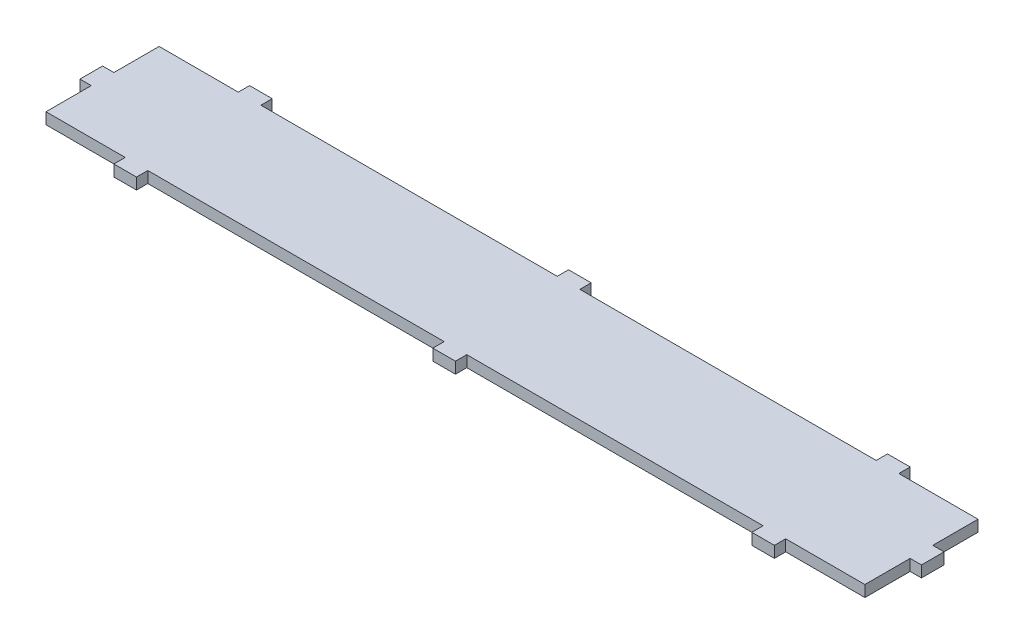
ISO-10303-21;
HEADER;
FILE_DESCRIPTION(('STEP AP214'),'2;1');
FILE_NAME('part.step','',(''),(''),'','','');
FILE_SCHEMA(('AUTOMOTIVE_DESIGN { 1 0 10303 214 1 1 1 1 }'));
ENDSEC;
DATA;
#1=APPLICATION_CONTEXT('core data for automotive mechanical design processes');
#2=APPLICATION_PROTOCOL_DEFINITION('international standard','automotive_design',2000,#1);
#3=PRODUCT_CONTEXT('',#1,'mechanical');
#4=PRODUCT('Part','Part','',(#3));
#5=PRODUCT_RELATED_PRODUCT_CATEGORY('part','',(#4));
#6=PRODUCT_DEFINITION_FORMATION('','',#4);
#7=PRODUCT_DEFINITION_CONTEXT('part definition',#1,'design');
#8=PRODUCT_DEFINITION('design','',#6,#7);
#9=PRODUCT_DEFINITION_SHAPE('','',#8);
#10=(LENGTH_UNIT() NAMED_UNIT(*) SI_UNIT(.MILLI.,.METRE.));
#11=(NAMED_UNIT(*) PLANE_ANGLE_UNIT() SI_UNIT($,.RADIAN.));
#12=(NAMED_UNIT(*) SI_UNIT($,.STERADIAN.) SOLID_ANGLE_UNIT());
#13=UNCERTAINTY_MEASURE_WITH_UNIT(LENGTH_MEASURE(1.E-05),#10,'distance_accuracy_value','');
#14=(GEOMETRIC_REPRESENTATION_CONTEXT(3) GLOBAL_UNCERTAINTY_ASSIGNED_CONTEXT((#13)) GLOBAL_UNIT_ASSIGNED_CONTEXT((#10,
#11,#12)) REPRESENTATION_CONTEXT('',''));
#15=CARTESIAN_POINT('',(0.,0.,0.));
#16=DIRECTION('',(0.,0.,1.));
#17=DIRECTION('',(1.,0.,0.));
#18=AXIS2_PLACEMENT_3D('',#15,#16,#17);
#19=CARTESIAN_POINT('',(0.,5.,30.));
#20=DIRECTION('',(0.,0.,1.));
#21=DIRECTION('',(1.,0.,0.));
#22=AXIS2_PLACEMENT_3D('',#19,#20,#21);
#23=PLANE('',#22);
#24=DIRECTION('',(-1.,0.,0.));
#25=VECTOR('',#24,1.);
#26=CARTESIAN_POINT('',(0.,0.,30.));
#27=LINE('',#26,#25);
#28=CARTESIAN_POINT('',(146.,0.,30.0000000000001));
#29=VERTEX_POINT('',#28);
#30=CARTESIAN_POINT('',(136.,0.,30.0000000000001));
#31=VERTEX_POINT('',#30);
#32=EDGE_CURVE('E309',#29,#31,#27,.T.);
#33=ORIENTED_EDGE('',*,*,#32,.F.);
#34=DIRECTION('',(0.,-1.,0.));
#35=VECTOR('',#34,1.);
#36=CARTESIAN_POINT('',(146.,5.,30.0000000000001));
#37=LINE('',#36,#35);
#38=CARTESIAN_POINT('',(146.,5.,30.0000000000001));
#39=VERTEX_POINT('',#38);
#40=EDGE_CURVE('E11',#39,#29,#37,.T.);
#41=ORIENTED_EDGE('',*,*,#40,.F.);
#42=DIRECTION('',(-1.,0.,0.));
#43=VECTOR('',#42,1.);
#44=CARTESIAN_POINT('',(0.,5.,30.));
#45=LINE('',#44,#43);
#46=CARTESIAN_POINT('',(136.,5.,30.0000000000001));
#47=VERTEX_POINT('',#46);
#48=EDGE_CURVE('E439',#39,#47,#45,.T.);
#49=ORIENTED_EDGE('',*,*,#48,.T.);
#50=DIRECTION('',(0.,-1.,0.));
#51=VECTOR('',#50,1.);
#52=CARTESIAN_POINT('',(136.,5.,30.0000000000001));
#53=LINE('',#52,#51);
#54=EDGE_CURVE('E176',#47,#31,#53,.T.);
#55=ORIENTED_EDGE('',*,*,#54,.T.);
#56=EDGE_LOOP('',(#33,#41,#49,#55));
#57=FACE_BOUND('',#56,.T.);
#58=ADVANCED_FACE('F41',(#57),#23,.T.);
#59=CARTESIAN_POINT('',(146.,5.,0.));
#60=DIRECTION('',(-1.,0.,0.));
#61=DIRECTION('',(0.,0.,1.));
#62=AXIS2_PLACEMENT_3D('',#59,#60,#61);
#63=PLANE('',#62);
#64=DIRECTION('',(0.,0.,-1.));
#65=VECTOR('',#64,1.);
#66=CARTESIAN_POINT('',(146.,0.,0.));
#67=LINE('',#66,#65);
#68=CARTESIAN_POINT('',(146.,0.,25.0000000000001));
#69=VERTEX_POINT('',#68);
#70=EDGE_CURVE('E313',#29,#69,#67,.T.);
#71=ORIENTED_EDGE('',*,*,#70,.T.);
#72=DIRECTION('',(0.,-1.,0.));
#73=VECTOR('',#72,1.);
#74=CARTESIAN_POINT('',(146.,5.,25.0000000000001));
#75=LINE('',#74,#73);
#76=CARTESIAN_POINT('',(146.,5.,25.0000000000001));
#77=VERTEX_POINT('',#76);
#78=EDGE_CURVE('E50',#77,#69,#75,.T.);
#79=ORIENTED_EDGE('',*,*,#78,.F.);
#80=DIRECTION('',(0.,0.,-1.));
#81=VECTOR('',#80,1.);
#82=CARTESIAN_POINT('',(146.,5.,0.));
#83=LINE('',#82,#81);
#84=EDGE_CURVE('E572',#39,#77,#83,.T.);
#85=ORIENTED_EDGE('',*,*,#84,.F.);
#86=ORIENTED_EDGE('',*,*,#40,.T.);
#87=EDGE_LOOP('',(#71,#79,#85,#86));
#88=FACE_BOUND('',#87,.T.);
#89=ADVANCED_FACE('F682',(#88),#63,.F.);
#90=CARTESIAN_POINT('',(-1.51168760049403E-13,5.,24.9999999999992));
#91=DIRECTION('',(0.,0.,-1.));
#92=DIRECTION('',(-1.,0.,0.));
#93=AXIS2_PLACEMENT_3D('',#90,#91,#92);
#94=PLANE('',#93);
#95=DIRECTION('',(1.,0.,0.));
#96=VECTOR('',#95,1.);
#97=CARTESIAN_POINT('',(-1.51168760049403E-13,0.,24.9999999999992));
#98=LINE('',#97,#96);
#99=CARTESIAN_POINT('',(181.,0.,25.0000000000003));
#100=VERTEX_POINT('',#99);
#101=EDGE_CURVE('E316',#69,#100,#98,.T.);
#102=ORIENTED_EDGE('',*,*,#101,.T.);
#103=DIRECTION('',(0.,-1.,0.));
#104=VECTOR('',#103,1.);
#105=CARTESIAN_POINT('',(181.,5.,25.0000000000003));
#106=LINE('',#105,#104);
#107=CARTESIAN_POINT('',(181.,5.,25.0000000000003));
#108=VERTEX_POINT('',#107);
#109=EDGE_CURVE('E541',#108,#100,#106,.T.);
#110=ORIENTED_EDGE('',*,*,#109,.F.);
#111=DIRECTION('',(1.,0.,0.));
#112=VECTOR('',#111,1.);
#113=CARTESIAN_POINT('',(-1.51168760049403E-13,5.,24.9999999999992));
#114=LINE('',#113,#112);
#115=EDGE_CURVE('E551',#77,#108,#114,.T.);
#116=ORIENTED_EDGE('',*,*,#115,.F.);
#117=ORIENTED_EDGE('',*,*,#78,.T.);
#118=EDGE_LOOP('',(#102,#110,#116,#117));
#119=FACE_BOUND('',#118,.T.);
#120=ADVANCED_FACE('F549',(#119),#94,.F.);
#121=CARTESIAN_POINT('',(181.,5.,0.));
#122=DIRECTION('',(1.,0.,0.));
#123=DIRECTION('',(0.,0.,-1.));
#124=AXIS2_PLACEMENT_3D('',#121,#122,#123);
#125=PLANE('',#124);
#126=DIRECTION('',(0.,0.,1.));
#127=VECTOR('',#126,1.);
#128=CARTESIAN_POINT('',(181.,0.,0.));
#129=LINE('',#128,#127);
#130=CARTESIAN_POINT('',(181.,0.,5.));
#131=VERTEX_POINT('',#130);
#132=EDGE_CURVE('E320',#131,#100,#129,.T.);
#133=ORIENTED_EDGE('',*,*,#132,.F.);
#134=DIRECTION('',(0.,-1.,0.));
#135=VECTOR('',#134,1.);
#136=CARTESIAN_POINT('',(181.,5.,5.));
#137=LINE('',#136,#135);
#138=CARTESIAN_POINT('',(181.,5.,5.));
#139=VERTEX_POINT('',#138);
#140=EDGE_CURVE('E538',#139,#131,#137,.T.);
#141=ORIENTED_EDGE('',*,*,#140,.F.);
#142=DIRECTION('',(0.,0.,1.));
#143=VECTOR('',#142,1.);
#144=CARTESIAN_POINT('',(181.,5.,0.));
#145=LINE('',#144,#143);
#146=EDGE_CURVE('E562',#139,#108,#145,.T.);
#147=ORIENTED_EDGE('',*,*,#146,.T.);
#148=ORIENTED_EDGE('',*,*,#109,.T.);
#149=EDGE_LOOP('',(#133,#141,#147,#148));
#150=FACE_BOUND('',#149,.T.);
#151=ADVANCED_FACE('F559',(#150),#125,.T.);
#152=CARTESIAN_POINT('',(0.,5.,5.00000000000003));
#153=DIRECTION('',(0.,0.,1.));
#154=DIRECTION('',(1.,0.,0.));
#155=AXIS2_PLACEMENT_3D('',#152,#153,#154);
#156=PLANE('',#155);
#157=DIRECTION('',(-1.,0.,0.));
#158=VECTOR('',#157,1.);
#159=CARTESIAN_POINT('',(0.,0.,5.00000000000003));
#160=LINE('',#159,#158);
#161=CARTESIAN_POINT('',(186.,0.,5.));
#162=VERTEX_POINT('',#161);
#163=EDGE_CURVE('E324',#162,#131,#160,.T.);
#164=ORIENTED_EDGE('',*,*,#163,.F.);
#165=DIRECTION('',(0.,-1.,0.));
#166=VECTOR('',#165,1.);
#167=CARTESIAN_POINT('',(186.,5.,5.));
#168=LINE('',#167,#166);
#169=CARTESIAN_POINT('',(186.,5.,5.));
#170=VERTEX_POINT('',#169);
#171=EDGE_CURVE('E535',#170,#162,#168,.T.);
#172=ORIENTED_EDGE('',*,*,#171,.F.);
#173=DIRECTION('',(-1.,0.,0.));
#174=VECTOR('',#173,1.);
#175=CARTESIAN_POINT('',(0.,5.,5.00000000000003));
#176=LINE('',#175,#174);
#177=EDGE_CURVE('E566',#170,#139,#176,.T.);
#178=ORIENTED_EDGE('',*,*,#177,.T.);
#179=ORIENTED_EDGE('',*,*,#140,.T.);
#180=EDGE_LOOP('',(#164,#172,#178,#179));
#181=FACE_BOUND('',#180,.T.);
#182=ADVANCED_FACE('F692',(#181),#156,.T.);
#183=CARTESIAN_POINT('',(186.,5.,0.));
#184=DIRECTION('',(1.,0.,0.));
#185=DIRECTION('',(0.,0.,-1.));
#186=AXIS2_PLACEMENT_3D('',#183,#184,#185);
#187=PLANE('',#186);
#188=DIRECTION('',(0.,0.,1.));
#189=VECTOR('',#188,1.);
#190=CARTESIAN_POINT('',(186.,0.,0.));
#191=LINE('',#190,#189);
#192=CARTESIAN_POINT('',(186.,0.,-5.));
#193=VERTEX_POINT('',#192);
#194=EDGE_CURVE('E328',#193,#162,#191,.T.);
#195=ORIENTED_EDGE('',*,*,#194,.F.);
#196=DIRECTION('',(0.,-1.,0.));
#197=VECTOR('',#196,1.);
#198=CARTESIAN_POINT('',(186.,5.,-5.));
#199=LINE('',#198,#197);
#200=CARTESIAN_POINT('',(186.,5.,-5.));
#201=VERTEX_POINT('',#200);
#202=EDGE_CURVE('E532',#201,#193,#199,.T.);
#203=ORIENTED_EDGE('',*,*,#202,.F.);
#204=DIRECTION('',(0.,0.,1.));
#205=VECTOR('',#204,1.);
#206=CARTESIAN_POINT('',(186.,5.,0.));
#207=LINE('',#206,#205);
#208=EDGE_CURVE('E570',#201,#170,#207,.T.);
#209=ORIENTED_EDGE('',*,*,#208,.T.);
#210=ORIENTED_EDGE('',*,*,#171,.T.);
#211=EDGE_LOOP('',(#195,#203,#209,#210));
#212=FACE_BOUND('',#211,.T.);
#213=ADVANCED_FACE('F695',(#212),#187,.T.);
#214=CARTESIAN_POINT('',(0.,5.,-4.99999999999997));
#215=DIRECTION('',(0.,0.,1.));
#216=DIRECTION('',(1.,0.,0.));
#217=AXIS2_PLACEMENT_3D('',#214,#215,#216);
#218=PLANE('',#217);
#219=DIRECTION('',(-1.,0.,0.));
#220=VECTOR('',#219,1.);
#221=CARTESIAN_POINT('',(0.,0.,-4.99999999999997));
#222=LINE('',#221,#220);
#223=CARTESIAN_POINT('',(181.,0.,-5.));
#224=VERTEX_POINT('',#223);
#225=EDGE_CURVE('E332',#193,#224,#222,.T.);
#226=ORIENTED_EDGE('',*,*,#225,.T.);
#227=DIRECTION('',(0.,-1.,0.));
#228=VECTOR('',#227,1.);
#229=CARTESIAN_POINT('',(181.,5.,-5.));
#230=LINE('',#229,#228);
#231=CARTESIAN_POINT('',(181.,5.,-5.));
#232=VERTEX_POINT('',#231);
#233=EDGE_CURVE('E528',#232,#224,#230,.T.);
#234=ORIENTED_EDGE('',*,*,#233,.F.);
#235=DIRECTION('',(-1.,0.,0.));
#236=VECTOR('',#235,1.);
#237=CARTESIAN_POINT('',(0.,5.,-4.99999999999997));
#238=LINE('',#237,#236);
#239=EDGE_CURVE('E579',#201,#232,#238,.T.);
#240=ORIENTED_EDGE('',*,*,#239,.F.);
#241=ORIENTED_EDGE('',*,*,#202,.T.);
#242=EDGE_LOOP('',(#226,#234,#240,#241));
#243=FACE_BOUND('',#242,.T.);
#244=ADVANCED_FACE('F699',(#243),#218,.F.);
#245=CARTESIAN_POINT('',(181.,5.,0.));
#246=DIRECTION('',(-1.,0.,0.));
#247=DIRECTION('',(0.,0.,1.));
#248=AXIS2_PLACEMENT_3D('',#245,#246,#247);
#249=PLANE('',#248);
#250=DIRECTION('',(0.,0.,-1.));
#251=VECTOR('',#250,1.);
#252=CARTESIAN_POINT('',(181.,0.,0.));
#253=LINE('',#252,#251);
#254=CARTESIAN_POINT('',(181.,0.,-25.0000000000001));
#255=VERTEX_POINT('',#254);
#256=EDGE_CURVE('E335',#224,#255,#253,.T.);
#257=ORIENTED_EDGE('',*,*,#256,.T.);
#258=DIRECTION('',(0.,-1.,0.));
#259=VECTOR('',#258,1.);
#260=CARTESIAN_POINT('',(181.,5.,-25.0000000000001));
#261=LINE('',#260,#259);
#262=CARTESIAN_POINT('',(181.,5.,-25.0000000000001));
#263=VERTEX_POINT('',#262);
#264=EDGE_CURVE('E525',#263,#255,#261,.T.);
#265=ORIENTED_EDGE('',*,*,#264,.F.);
#266=DIRECTION('',(0.,0.,-1.));
#267=VECTOR('',#266,1.);
#268=CARTESIAN_POINT('',(181.,5.,0.));
#269=LINE('',#268,#267);
#270=EDGE_CURVE('E582',#232,#263,#269,.T.);
#271=ORIENTED_EDGE('',*,*,#270,.F.);
#272=ORIENTED_EDGE('',*,*,#233,.T.);
#273=EDGE_LOOP('',(#257,#265,#271,#272));
#274=FACE_BOUND('',#273,.T.);
#275=ADVANCED_FACE('F703',(#274),#249,.F.);
#276=CARTESIAN_POINT('',(0.,5.,-25.0000000000001));
#277=DIRECTION('',(0.,0.,-1.));
#278=DIRECTION('',(-1.,0.,0.));
#279=AXIS2_PLACEMENT_3D('',#276,#277,#278);
#280=PLANE('',#279);
#281=DIRECTION('',(1.,0.,0.));
#282=VECTOR('',#281,1.);
#283=CARTESIAN_POINT('',(0.,0.,-25.0000000000001));
#284=LINE('',#283,#282);
#285=CARTESIAN_POINT('',(146.,0.,-25.0000000000001));
#286=VERTEX_POINT('',#285);
#287=EDGE_CURVE('E339',#286,#255,#284,.T.);
#288=ORIENTED_EDGE('',*,*,#287,.F.);
#289=DIRECTION('',(0.,-1.,0.));
#290=VECTOR('',#289,1.);
#291=CARTESIAN_POINT('',(146.,5.,-25.0000000000001));
#292=LINE('',#291,#290);
#293=CARTESIAN_POINT('',(146.,5.,-25.0000000000001));
#294=VERTEX_POINT('',#293);
#295=EDGE_CURVE('E522',#294,#286,#292,.T.);
#296=ORIENTED_EDGE('',*,*,#295,.F.);
#297=DIRECTION('',(1.,0.,0.));
#298=VECTOR('',#297,1.);
#299=CARTESIAN_POINT('',(0.,5.,-25.0000000000001));
#300=LINE('',#299,#298);
#301=EDGE_CURVE('E585',#294,#263,#300,.T.);
#302=ORIENTED_EDGE('',*,*,#301,.T.);
#303=ORIENTED_EDGE('',*,*,#264,.T.);
#304=EDGE_LOOP('',(#288,#296,#302,#303));
#305=FACE_BOUND('',#304,.T.);
#306=ADVANCED_FACE('F707',(#305),#280,.T.);
#307=CARTESIAN_POINT('',(146.,5.,0.));
#308=DIRECTION('',(1.,0.,0.));
#309=DIRECTION('',(0.,0.,-1.));
#310=AXIS2_PLACEMENT_3D('',#307,#308,#309);
#311=PLANE('',#310);
#312=DIRECTION('',(0.,0.,1.));
#313=VECTOR('',#312,1.);
#314=CARTESIAN_POINT('',(146.,0.,0.));
#315=LINE('',#314,#313);
#316=CARTESIAN_POINT('',(146.,0.,-30.0000000000001));
#317=VERTEX_POINT('',#316);
#318=EDGE_CURVE('E343',#317,#286,#315,.T.);
#319=ORIENTED_EDGE('',*,*,#318,.F.);
#320=DIRECTION('',(0.,-1.,0.));
#321=VECTOR('',#320,1.);
#322=CARTESIAN_POINT('',(146.,5.,-30.0000000000001));
#323=LINE('',#322,#321);
#324=CARTESIAN_POINT('',(146.,5.,-30.0000000000001));
#325=VERTEX_POINT('',#324);
#326=EDGE_CURVE('E519',#325,#317,#323,.T.);
#327=ORIENTED_EDGE('',*,*,#326,.F.);
#328=DIRECTION('',(0.,0.,1.));
#329=VECTOR('',#328,1.);
#330=CARTESIAN_POINT('',(146.,5.,0.));
#331=LINE('',#330,#329);
#332=EDGE_CURVE('E589',#325,#294,#331,.T.);
#333=ORIENTED_EDGE('',*,*,#332,.T.);
#334=ORIENTED_EDGE('',*,*,#295,.T.);
#335=EDGE_LOOP('',(#319,#327,#333,#334));
#336=FACE_BOUND('',#335,.T.);
#337=ADVANCED_FACE('F711',(#336),#311,.T.);
#338=CARTESIAN_POINT('',(0.,5.,-30.));
#339=DIRECTION('',(0.,0.,1.));
#340=DIRECTION('',(1.,0.,0.));
#341=AXIS2_PLACEMENT_3D('',#338,#339,#340);
#342=PLANE('',#341);
#343=DIRECTION('',(-1.,0.,0.));
#344=VECTOR('',#343,1.);
#345=CARTESIAN_POINT('',(0.,0.,-30.));
#346=LINE('',#345,#344);
#347=CARTESIAN_POINT('',(136.,0.,-30.0000000000001));
#348=VERTEX_POINT('',#347);
#349=EDGE_CURVE('E347',#317,#348,#346,.T.);
#350=ORIENTED_EDGE('',*,*,#349,.T.);
#351=DIRECTION('',(0.,-1.,0.));
#352=VECTOR('',#351,1.);
#353=CARTESIAN_POINT('',(136.,5.,-30.0000000000001));
#354=LINE('',#353,#352);
#355=CARTESIAN_POINT('',(136.,5.,-30.0000000000001));
#356=VERTEX_POINT('',#355);
#357=EDGE_CURVE('E516',#356,#348,#354,.T.);
#358=ORIENTED_EDGE('',*,*,#357,.F.);
#359=DIRECTION('',(-1.,0.,0.));
#360=VECTOR('',#359,1.);
#361=CARTESIAN_POINT('',(0.,5.,-30.));
#362=LINE('',#361,#360);
#363=EDGE_CURVE('E593',#325,#356,#362,.T.);
#364=ORIENTED_EDGE('',*,*,#363,.F.);
#365=ORIENTED_EDGE('',*,*,#326,.T.);
#366=EDGE_LOOP('',(#350,#358,#364,#365));
#367=FACE_BOUND('',#366,.T.);
#368=ADVANCED_FACE('F715',(#367),#342,.F.);
#369=CARTESIAN_POINT('',(136.,5.,0.));
#370=DIRECTION('',(-1.,0.,0.));
#371=DIRECTION('',(0.,0.,1.));
#372=AXIS2_PLACEMENT_3D('',#369,#370,#371);
#373=PLANE('',#372);
#374=DIRECTION('',(0.,0.,-1.));
#375=VECTOR('',#374,1.);
#376=CARTESIAN_POINT('',(136.,0.,0.));
#377=LINE('',#376,#375);
#378=CARTESIAN_POINT('',(136.,0.,-25.0000000000001));
#379=VERTEX_POINT('',#378);
#380=EDGE_CURVE('E351',#379,#348,#377,.T.);
#381=ORIENTED_EDGE('',*,*,#380,.F.);
#382=DIRECTION('',(0.,-1.,0.));
#383=VECTOR('',#382,1.);
#384=CARTESIAN_POINT('',(136.,5.,-25.0000000000001));
#385=LINE('',#384,#383);
#386=CARTESIAN_POINT('',(136.,5.,-25.0000000000001));
#387=VERTEX_POINT('',#386);
#388=EDGE_CURVE('E513',#387,#379,#385,.T.);
#389=ORIENTED_EDGE('',*,*,#388,.F.);
#390=DIRECTION('',(0.,0.,-1.));
#391=VECTOR('',#390,1.);
#392=CARTESIAN_POINT('',(136.,5.,0.));
#393=LINE('',#392,#391);
#394=EDGE_CURVE('E596',#387,#356,#393,.T.);
#395=ORIENTED_EDGE('',*,*,#394,.T.);
#396=ORIENTED_EDGE('',*,*,#357,.T.);
#397=EDGE_LOOP('',(#381,#389,#395,#396));
#398=FACE_BOUND('',#397,.T.);
#399=ADVANCED_FACE('F719',(#398),#373,.T.);
#400=CARTESIAN_POINT('',(0.,5.,-25.0000000000001));
#401=DIRECTION('',(0.,0.,-1.));
#402=DIRECTION('',(-1.,0.,0.));
#403=AXIS2_PLACEMENT_3D('',#400,#401,#402);
#404=PLANE('',#403);
#405=DIRECTION('',(1.,0.,0.));
#406=VECTOR('',#405,1.);
#407=CARTESIAN_POINT('',(0.,0.,-25.0000000000001));
#408=LINE('',#407,#406);
#409=CARTESIAN_POINT('',(5.,0.,-25.0000000000001));
#410=VERTEX_POINT('',#409);
#411=EDGE_CURVE('E355',#410,#379,#408,.T.);
#412=ORIENTED_EDGE('',*,*,#411,.F.);
#413=DIRECTION('',(0.,-1.,0.));
#414=VECTOR('',#413,1.);
#415=CARTESIAN_POINT('',(5.,5.,-25.0000000000001));
#416=LINE('',#415,#414);
#417=CARTESIAN_POINT('',(5.,5.,-25.0000000000001));
#418=VERTEX_POINT('',#417);
#419=EDGE_CURVE('E510',#418,#410,#416,.T.);
#420=ORIENTED_EDGE('',*,*,#419,.F.);
#421=DIRECTION('',(1.,0.,0.));
#422=VECTOR('',#421,1.);
#423=CARTESIAN_POINT('',(0.,5.,-25.0000000000001));
#424=LINE('',#423,#422);
#425=EDGE_CURVE('E600',#418,#387,#424,.T.);
#426=ORIENTED_EDGE('',*,*,#425,.T.);
#427=ORIENTED_EDGE('',*,*,#388,.T.);
#428=EDGE_LOOP('',(#412,#420,#426,#427));
#429=FACE_BOUND('',#428,.T.);
#430=ADVANCED_FACE('F723',(#429),#404,.T.);
#431=CARTESIAN_POINT('',(4.99999999999998,5.,0.));
#432=DIRECTION('',(-1.,0.,0.));
#433=DIRECTION('',(0.,0.,1.));
#434=AXIS2_PLACEMENT_3D('',#431,#432,#433);
#435=PLANE('',#434);
#436=DIRECTION('',(0.,0.,-1.));
#437=VECTOR('',#436,1.);
#438=CARTESIAN_POINT('',(4.99999999999998,0.,0.));
#439=LINE('',#438,#437);
#440=CARTESIAN_POINT('',(5.,0.,-30.));
#441=VERTEX_POINT('',#440);
#442=EDGE_CURVE('E359',#410,#441,#439,.T.);
#443=ORIENTED_EDGE('',*,*,#442,.T.);
#444=DIRECTION('',(0.,-1.,0.));
#445=VECTOR('',#444,1.);
#446=CARTESIAN_POINT('',(5.,5.,-30.));
#447=LINE('',#446,#445);
#448=CARTESIAN_POINT('',(5.,5.,-30.));
#449=VERTEX_POINT('',#448);
#450=EDGE_CURVE('E506',#449,#441,#447,.T.);
#451=ORIENTED_EDGE('',*,*,#450,.F.);
#452=DIRECTION('',(0.,0.,-1.));
#453=VECTOR('',#452,1.);
#454=CARTESIAN_POINT('',(4.99999999999998,5.,0.));
#455=LINE('',#454,#453);
#456=EDGE_CURVE('E604',#418,#449,#455,.T.);
#457=ORIENTED_EDGE('',*,*,#456,.F.);
#458=ORIENTED_EDGE('',*,*,#419,.T.);
#459=EDGE_LOOP('',(#443,#451,#457,#458));
#460=FACE_BOUND('',#459,.T.);
#461=ADVANCED_FACE('F727',(#460),#435,.F.);
#462=CARTESIAN_POINT('',(0.,5.,-30.));
#463=DIRECTION('',(0.,0.,1.));
#464=DIRECTION('',(1.,0.,0.));
#465=AXIS2_PLACEMENT_3D('',#462,#463,#464);
#466=PLANE('',#465);
#467=DIRECTION('',(-1.,0.,0.));
#468=VECTOR('',#467,1.);
#469=CARTESIAN_POINT('',(0.,0.,-30.));
#470=LINE('',#469,#468);
#471=CARTESIAN_POINT('',(-5.,0.,-30.));
#472=VERTEX_POINT('',#471);
#473=EDGE_CURVE('E362',#441,#472,#470,.T.);
#474=ORIENTED_EDGE('',*,*,#473,.T.);
#475=DIRECTION('',(0.,-1.,0.));
#476=VECTOR('',#475,1.);
#477=CARTESIAN_POINT('',(-5.,5.,-30.));
#478=LINE('',#477,#476);
#479=CARTESIAN_POINT('',(-5.,5.,-30.));
#480=VERTEX_POINT('',#479);
#481=EDGE_CURVE('E503',#480,#472,#478,.T.);
#482=ORIENTED_EDGE('',*,*,#481,.F.);
#483=DIRECTION('',(-1.,0.,0.));
#484=VECTOR('',#483,1.);
#485=CARTESIAN_POINT('',(0.,5.,-30.));
#486=LINE('',#485,#484);
#487=EDGE_CURVE('E607',#449,#480,#486,.T.);
#488=ORIENTED_EDGE('',*,*,#487,.F.);
#489=ORIENTED_EDGE('',*,*,#450,.T.);
#490=EDGE_LOOP('',(#474,#482,#488,#489));
#491=FACE_BOUND('',#490,.T.);
#492=ADVANCED_FACE('F731',(#491),#466,.F.);
#493=CARTESIAN_POINT('',(-5.,5.,0.));
#494=DIRECTION('',(-1.,0.,0.));
#495=DIRECTION('',(0.,0.,1.));
#496=AXIS2_PLACEMENT_3D('',#493,#494,#495);
#497=PLANE('',#496);
#498=DIRECTION('',(0.,0.,-1.));
#499=VECTOR('',#498,1.);
#500=CARTESIAN_POINT('',(-5.,0.,0.));
#501=LINE('',#500,#499);
#502=CARTESIAN_POINT('',(-5.,0.,-25.0000000000001));
#503=VERTEX_POINT('',#502);
#504=EDGE_CURVE('E366',#503,#472,#501,.T.);
#505=ORIENTED_EDGE('',*,*,#504,.F.);
#506=DIRECTION('',(0.,-1.,0.));
#507=VECTOR('',#506,1.);
#508=CARTESIAN_POINT('',(-5.,5.,-25.0000000000001));
#509=LINE('',#508,#507);
#510=CARTESIAN_POINT('',(-5.,5.,-25.0000000000001));
#511=VERTEX_POINT('',#510);
#512=EDGE_CURVE('E500',#511,#503,#509,.T.);
#513=ORIENTED_EDGE('',*,*,#512,.F.);
#514=DIRECTION('',(0.,0.,-1.));
#515=VECTOR('',#514,1.);
#516=CARTESIAN_POINT('',(-5.,5.,0.));
#517=LINE('',#516,#515);
#518=EDGE_CURVE('E610',#511,#480,#517,.T.);
#519=ORIENTED_EDGE('',*,*,#518,.T.);
#520=ORIENTED_EDGE('',*,*,#481,.T.);
#521=EDGE_LOOP('',(#505,#513,#519,#520));
#522=FACE_BOUND('',#521,.T.);
#523=ADVANCED_FACE('F735',(#522),#497,.T.);
#524=CARTESIAN_POINT('',(0.,5.,-25.0000000000001));
#525=DIRECTION('',(0.,0.,-1.));
#526=DIRECTION('',(-1.,0.,0.));
#527=AXIS2_PLACEMENT_3D('',#524,#525,#526);
#528=PLANE('',#527);
#529=DIRECTION('',(1.,0.,0.));
#530=VECTOR('',#529,1.);
#531=CARTESIAN_POINT('',(0.,0.,-25.0000000000001));
#532=LINE('',#531,#530);
#533=CARTESIAN_POINT('',(-136.,0.,-25.));
#534=VERTEX_POINT('',#533);
#535=EDGE_CURVE('E370',#534,#503,#532,.T.);
#536=ORIENTED_EDGE('',*,*,#535,.F.);
#537=DIRECTION('',(0.,-1.,0.));
#538=VECTOR('',#537,1.);
#539=CARTESIAN_POINT('',(-136.,5.,-25.));
#540=LINE('',#539,#538);
#541=CARTESIAN_POINT('',(-136.,5.,-25.));
#542=VERTEX_POINT('',#541);
#543=EDGE_CURVE('E497',#542,#534,#540,.T.);
#544=ORIENTED_EDGE('',*,*,#543,.F.);
#545=DIRECTION('',(1.,0.,0.));
#546=VECTOR('',#545,1.);
#547=CARTESIAN_POINT('',(0.,5.,-25.0000000000001));
#548=LINE('',#547,#546);
#549=EDGE_CURVE('E614',#542,#511,#548,.T.);
#550=ORIENTED_EDGE('',*,*,#549,.T.);
#551=ORIENTED_EDGE('',*,*,#512,.T.);
#552=EDGE_LOOP('',(#536,#544,#550,#551));
#553=FACE_BOUND('',#552,.T.);
#554=ADVANCED_FACE('F739',(#553),#528,.T.);
#555=CARTESIAN_POINT('',(-136.,5.,0.));
#556=DIRECTION('',(-1.,0.,0.));
#557=DIRECTION('',(0.,0.,1.));
#558=AXIS2_PLACEMENT_3D('',#555,#556,#557);
#559=PLANE('',#558);
#560=DIRECTION('',(0.,0.,-1.));
#561=VECTOR('',#560,1.);
#562=CARTESIAN_POINT('',(-136.,0.,0.));
#563=LINE('',#562,#561);
#564=CARTESIAN_POINT('',(-136.,0.,-30.));
#565=VERTEX_POINT('',#564);
#566=EDGE_CURVE('E374',#534,#565,#563,.T.);
#567=ORIENTED_EDGE('',*,*,#566,.T.);
#568=DIRECTION('',(0.,-1.,0.));
#569=VECTOR('',#568,1.);
#570=CARTESIAN_POINT('',(-136.,5.,-30.));
#571=LINE('',#570,#569);
#572=CARTESIAN_POINT('',(-136.,5.,-30.));
#573=VERTEX_POINT('',#572);
#574=EDGE_CURVE('E493',#573,#565,#571,.T.);
#575=ORIENTED_EDGE('',*,*,#574,.F.);
#576=DIRECTION('',(0.,0.,-1.));
#577=VECTOR('',#576,1.);
#578=CARTESIAN_POINT('',(-136.,5.,0.));
#579=LINE('',#578,#577);
#580=EDGE_CURVE('E618',#542,#573,#579,.T.);
#581=ORIENTED_EDGE('',*,*,#580,.F.);
#582=ORIENTED_EDGE('',*,*,#543,.T.);
#583=EDGE_LOOP('',(#567,#575,#581,#582));
#584=FACE_BOUND('',#583,.T.);
#585=ADVANCED_FACE('F743',(#584),#559,.F.);
#586=CARTESIAN_POINT('',(0.,5.,-30.0000000000001));
#587=DIRECTION('',(0.,0.,1.));
#588=DIRECTION('',(1.,0.,0.));
#589=AXIS2_PLACEMENT_3D('',#586,#587,#588);
#590=PLANE('',#589);
#591=DIRECTION('',(-1.,0.,0.));
#592=VECTOR('',#591,1.);
#593=CARTESIAN_POINT('',(0.,0.,-30.0000000000001));
#594=LINE('',#593,#592);
#595=CARTESIAN_POINT('',(-146.,0.,-30.));
#596=VERTEX_POINT('',#595);
#597=EDGE_CURVE('E377',#565,#596,#594,.T.);
#598=ORIENTED_EDGE('',*,*,#597,.T.);
#599=DIRECTION('',(0.,-1.,0.));
#600=VECTOR('',#599,1.);
#601=CARTESIAN_POINT('',(-146.,5.,-30.));
#602=LINE('',#601,#600);
#603=CARTESIAN_POINT('',(-146.,5.,-30.));
#604=VERTEX_POINT('',#603);
#605=EDGE_CURVE('E489',#604,#596,#602,.T.);
#606=ORIENTED_EDGE('',*,*,#605,.F.);
#607=DIRECTION('',(-1.,0.,0.));
#608=VECTOR('',#607,1.);
#609=CARTESIAN_POINT('',(0.,5.,-30.0000000000001));
#610=LINE('',#609,#608);
#611=EDGE_CURVE('E621',#573,#604,#610,.T.);
#612=ORIENTED_EDGE('',*,*,#611,.F.);
#613=ORIENTED_EDGE('',*,*,#574,.T.);
#614=EDGE_LOOP('',(#598,#606,#612,#613));
#615=FACE_BOUND('',#614,.T.);
#616=ADVANCED_FACE('F747',(#615),#590,.F.);
#617=CARTESIAN_POINT('',(-146.,5.,0.));
#618=DIRECTION('',(1.,0.,0.));
#619=DIRECTION('',(0.,0.,-1.));
#620=AXIS2_PLACEMENT_3D('',#617,#618,#619);
#621=PLANE('',#620);
#622=DIRECTION('',(0.,0.,1.));
#623=VECTOR('',#622,1.);
#624=CARTESIAN_POINT('',(-146.,0.,0.));
#625=LINE('',#624,#623);
#626=CARTESIAN_POINT('',(-146.,0.,-25.));
#627=VERTEX_POINT('',#626);
#628=EDGE_CURVE('E380',#596,#627,#625,.T.);
#629=ORIENTED_EDGE('',*,*,#628,.T.);
#630=DIRECTION('',(0.,-1.,0.));
#631=VECTOR('',#630,1.);
#632=CARTESIAN_POINT('',(-146.,5.,-25.));
#633=LINE('',#632,#631);
#634=CARTESIAN_POINT('',(-146.,5.,-25.));
#635=VERTEX_POINT('',#634);
#636=EDGE_CURVE('E486',#635,#627,#633,.T.);
#637=ORIENTED_EDGE('',*,*,#636,.F.);
#638=DIRECTION('',(0.,0.,1.));
#639=VECTOR('',#638,1.);
#640=CARTESIAN_POINT('',(-146.,5.,0.));
#641=LINE('',#640,#639);
#642=EDGE_CURVE('E624',#604,#635,#641,.T.);
#643=ORIENTED_EDGE('',*,*,#642,.F.);
#644=ORIENTED_EDGE('',*,*,#605,.T.);
#645=EDGE_LOOP('',(#629,#637,#643,#644));
#646=FACE_BOUND('',#645,.T.);
#647=ADVANCED_FACE('F751',(#646),#621,.F.);
#648=CARTESIAN_POINT('',(0.,5.,-25.0000000000001));
#649=DIRECTION('',(0.,0.,-1.));
#650=DIRECTION('',(-1.,0.,0.));
#651=AXIS2_PLACEMENT_3D('',#648,#649,#650);
#652=PLANE('',#651);
#653=DIRECTION('',(1.,0.,0.));
#654=VECTOR('',#653,1.);
#655=CARTESIAN_POINT('',(0.,0.,-25.0000000000001));
#656=LINE('',#655,#654);
#657=CARTESIAN_POINT('',(-181.,0.,-25.));
#658=VERTEX_POINT('',#657);
#659=EDGE_CURVE('E384',#658,#627,#656,.T.);
#660=ORIENTED_EDGE('',*,*,#659,.F.);
#661=DIRECTION('',(0.,-1.,0.));
#662=VECTOR('',#661,1.);
#663=CARTESIAN_POINT('',(-181.,5.,-25.));
#664=LINE('',#663,#662);
#665=CARTESIAN_POINT('',(-181.,5.,-25.));
#666=VERTEX_POINT('',#665);
#667=EDGE_CURVE('E483',#666,#658,#664,.T.);
#668=ORIENTED_EDGE('',*,*,#667,.F.);
#669=DIRECTION('',(1.,0.,0.));
#670=VECTOR('',#669,1.);
#671=CARTESIAN_POINT('',(0.,5.,-25.0000000000001));
#672=LINE('',#671,#670);
#673=EDGE_CURVE('E627',#666,#635,#672,.T.);
#674=ORIENTED_EDGE('',*,*,#673,.T.);
#675=ORIENTED_EDGE('',*,*,#636,.T.);
#676=EDGE_LOOP('',(#660,#668,#674,#675));
#677=FACE_BOUND('',#676,.T.);
#678=ADVANCED_FACE('F755',(#677),#652,.T.);
#679=CARTESIAN_POINT('',(-181.,5.,0.));
#680=DIRECTION('',(1.,0.,0.));
#681=DIRECTION('',(0.,0.,-1.));
#682=AXIS2_PLACEMENT_3D('',#679,#680,#681);
#683=PLANE('',#682);
#684=DIRECTION('',(0.,0.,1.));
#685=VECTOR('',#684,1.);
#686=CARTESIAN_POINT('',(-181.,0.,0.));
#687=LINE('',#686,#685);
#688=CARTESIAN_POINT('',(-181.,0.,-5.00000000000002));
#689=VERTEX_POINT('',#688);
#690=EDGE_CURVE('E388',#658,#689,#687,.T.);
#691=ORIENTED_EDGE('',*,*,#690,.T.);
#692=DIRECTION('',(0.,-1.,0.));
#693=VECTOR('',#692,1.);
#694=CARTESIAN_POINT('',(-181.,5.,-5.00000000000002));
#695=LINE('',#694,#693);
#696=CARTESIAN_POINT('',(-181.,5.,-5.00000000000002));
#697=VERTEX_POINT('',#696);
#698=EDGE_CURVE('E479',#697,#689,#695,.T.);
#699=ORIENTED_EDGE('',*,*,#698,.F.);
#700=DIRECTION('',(0.,0.,1.));
#701=VECTOR('',#700,1.);
#702=CARTESIAN_POINT('',(-181.,5.,0.));
#703=LINE('',#702,#701);
#704=EDGE_CURVE('E631',#666,#697,#703,.T.);
#705=ORIENTED_EDGE('',*,*,#704,.F.);
#706=ORIENTED_EDGE('',*,*,#667,.T.);
#707=EDGE_LOOP('',(#691,#699,#705,#706));
#708=FACE_BOUND('',#707,.T.);
#709=ADVANCED_FACE('F759',(#708),#683,.F.);
#710=CARTESIAN_POINT('',(0.,5.,-5.0000000000015));
#711=DIRECTION('',(0.,0.,1.));
#712=DIRECTION('',(1.,0.,0.));
#713=AXIS2_PLACEMENT_3D('',#710,#711,#712);
#714=PLANE('',#713);
#715=DIRECTION('',(-1.,0.,0.));
#716=VECTOR('',#715,1.);
#717=CARTESIAN_POINT('',(0.,0.,-5.0000000000015));
#718=LINE('',#717,#716);
#719=CARTESIAN_POINT('',(-186.,0.,-4.99999999999998));
#720=VERTEX_POINT('',#719);
#721=EDGE_CURVE('E391',#689,#720,#718,.T.);
#722=ORIENTED_EDGE('',*,*,#721,.T.);
#723=DIRECTION('',(0.,-1.,0.));
#724=VECTOR('',#723,1.);
#725=CARTESIAN_POINT('',(-186.,5.,-4.99999999999998));
#726=LINE('',#725,#724);
#727=CARTESIAN_POINT('',(-186.,5.,-4.99999999999998));
#728=VERTEX_POINT('',#727);
#729=EDGE_CURVE('E475',#728,#720,#726,.T.);
#730=ORIENTED_EDGE('',*,*,#729,.F.);
#731=DIRECTION('',(-1.,0.,0.));
#732=VECTOR('',#731,1.);
#733=CARTESIAN_POINT('',(0.,5.,-5.0000000000015));
#734=LINE('',#733,#732);
#735=EDGE_CURVE('E634',#697,#728,#734,.T.);
#736=ORIENTED_EDGE('',*,*,#735,.F.);
#737=ORIENTED_EDGE('',*,*,#698,.T.);
#738=EDGE_LOOP('',(#722,#730,#736,#737));
#739=FACE_BOUND('',#738,.T.);
#740=ADVANCED_FACE('F763',(#739),#714,.F.);
#741=CARTESIAN_POINT('',(-186.,5.,0.));
#742=DIRECTION('',(1.,0.,0.));
#743=DIRECTION('',(0.,0.,-1.));
#744=AXIS2_PLACEMENT_3D('',#741,#742,#743);
#745=PLANE('',#744);
#746=DIRECTION('',(0.,0.,1.));
#747=VECTOR('',#746,1.);
#748=CARTESIAN_POINT('',(-186.,0.,0.));
#749=LINE('',#748,#747);
#750=CARTESIAN_POINT('',(-186.,0.,4.99999999999998));
#751=VERTEX_POINT('',#750);
#752=EDGE_CURVE('E394',#720,#751,#749,.T.);
#753=ORIENTED_EDGE('',*,*,#752,.T.);
#754=DIRECTION('',(0.,-1.,0.));
#755=VECTOR('',#754,1.);
#756=CARTESIAN_POINT('',(-186.,5.,4.99999999999998));
#757=LINE('',#756,#755);
#758=CARTESIAN_POINT('',(-186.,5.,4.99999999999998));
#759=VERTEX_POINT('',#758);
#760=EDGE_CURVE('E472',#759,#751,#757,.T.);
#761=ORIENTED_EDGE('',*,*,#760,.F.);
#762=DIRECTION('',(0.,0.,1.));
#763=VECTOR('',#762,1.);
#764=CARTESIAN_POINT('',(-186.,5.,0.));
#765=LINE('',#764,#763);
#766=EDGE_CURVE('E637',#728,#759,#765,.T.);
#767=ORIENTED_EDGE('',*,*,#766,.F.);
#768=ORIENTED_EDGE('',*,*,#729,.T.);
#769=EDGE_LOOP('',(#753,#761,#767,#768));
#770=FACE_BOUND('',#769,.T.);
#771=ADVANCED_FACE('F767',(#770),#745,.F.);
#772=CARTESIAN_POINT('',(0.,5.,5.00000000000001));
#773=DIRECTION('',(0.,0.,1.));
#774=DIRECTION('',(1.,0.,0.));
#775=AXIS2_PLACEMENT_3D('',#772,#773,#774);
#776=PLANE('',#775);
#777=DIRECTION('',(-1.,0.,0.));
#778=VECTOR('',#777,1.);
#779=CARTESIAN_POINT('',(0.,0.,5.00000000000001));
#780=LINE('',#779,#778);
#781=CARTESIAN_POINT('',(-181.,0.,4.99999999999998));
#782=VERTEX_POINT('',#781);
#783=EDGE_CURVE('E398',#782,#751,#780,.T.);
#784=ORIENTED_EDGE('',*,*,#783,.F.);
#785=DIRECTION('',(0.,-1.,0.));
#786=VECTOR('',#785,1.);
#787=CARTESIAN_POINT('',(-181.,5.,4.99999999999998));
#788=LINE('',#787,#786);
#789=CARTESIAN_POINT('',(-181.,5.,4.99999999999998));
#790=VERTEX_POINT('',#789);
#791=EDGE_CURVE('E469',#790,#782,#788,.T.);
#792=ORIENTED_EDGE('',*,*,#791,.F.);
#793=DIRECTION('',(-1.,0.,0.));
#794=VECTOR('',#793,1.);
#795=CARTESIAN_POINT('',(0.,5.,5.00000000000001));
#796=LINE('',#795,#794);
#797=EDGE_CURVE('E640',#790,#759,#796,.T.);
#798=ORIENTED_EDGE('',*,*,#797,.T.);
#799=ORIENTED_EDGE('',*,*,#760,.T.);
#800=EDGE_LOOP('',(#784,#792,#798,#799));
#801=FACE_BOUND('',#800,.T.);
#802=ADVANCED_FACE('F771',(#801),#776,.T.);
#803=CARTESIAN_POINT('',(-181.,5.,0.));
#804=DIRECTION('',(1.,0.,0.));
#805=DIRECTION('',(0.,0.,-1.));
#806=AXIS2_PLACEMENT_3D('',#803,#804,#805);
#807=PLANE('',#806);
#808=DIRECTION('',(0.,0.,1.));
#809=VECTOR('',#808,1.);
#810=CARTESIAN_POINT('',(-181.,0.,0.));
#811=LINE('',#810,#809);
#812=CARTESIAN_POINT('',(-181.,0.,25.));
#813=VERTEX_POINT('',#812);
#814=EDGE_CURVE('E402',#782,#813,#811,.T.);
#815=ORIENTED_EDGE('',*,*,#814,.T.);
#816=DIRECTION('',(0.,-1.,0.));
#817=VECTOR('',#816,1.);
#818=CARTESIAN_POINT('',(-181.,5.,25.));
#819=LINE('',#818,#817);
#820=CARTESIAN_POINT('',(-181.,5.,25.));
#821=VERTEX_POINT('',#820);
#822=EDGE_CURVE('E465',#821,#813,#819,.T.);
#823=ORIENTED_EDGE('',*,*,#822,.F.);
#824=DIRECTION('',(0.,0.,1.));
#825=VECTOR('',#824,1.);
#826=CARTESIAN_POINT('',(-181.,5.,0.));
#827=LINE('',#826,#825);
#828=EDGE_CURVE('E644',#790,#821,#827,.T.);
#829=ORIENTED_EDGE('',*,*,#828,.F.);
#830=ORIENTED_EDGE('',*,*,#791,.T.);
#831=EDGE_LOOP('',(#815,#823,#829,#830));
#832=FACE_BOUND('',#831,.T.);
#833=ADVANCED_FACE('F775',(#832),#807,.F.);
#834=CARTESIAN_POINT('',(0.,5.,25.0000000000002));
#835=DIRECTION('',(0.,0.,-1.));
#836=DIRECTION('',(-1.,0.,0.));
#837=AXIS2_PLACEMENT_3D('',#834,#835,#836);
#838=PLANE('',#837);
#839=DIRECTION('',(1.,0.,0.));
#840=VECTOR('',#839,1.);
#841=CARTESIAN_POINT('',(0.,0.,25.0000000000002));
#842=LINE('',#841,#840);
#843=CARTESIAN_POINT('',(-146.,0.,25.));
#844=VERTEX_POINT('',#843);
#845=EDGE_CURVE('E405',#813,#844,#842,.T.);
#846=ORIENTED_EDGE('',*,*,#845,.T.);
#847=DIRECTION('',(0.,-1.,0.));
#848=VECTOR('',#847,1.);
#849=CARTESIAN_POINT('',(-146.,5.,25.));
#850=LINE('',#849,#848);
#851=CARTESIAN_POINT('',(-146.,5.,25.));
#852=VERTEX_POINT('',#851);
#853=EDGE_CURVE('E462',#852,#844,#850,.T.);
#854=ORIENTED_EDGE('',*,*,#853,.F.);
#855=DIRECTION('',(1.,0.,0.));
#856=VECTOR('',#855,1.);
#857=CARTESIAN_POINT('',(0.,5.,25.0000000000002));
#858=LINE('',#857,#856);
#859=EDGE_CURVE('E647',#821,#852,#858,.T.);
#860=ORIENTED_EDGE('',*,*,#859,.F.);
#861=ORIENTED_EDGE('',*,*,#822,.T.);
#862=EDGE_LOOP('',(#846,#854,#860,#861));
#863=FACE_BOUND('',#862,.T.);
#864=ADVANCED_FACE('F779',(#863),#838,.F.);
#865=CARTESIAN_POINT('',(-146.,5.,0.));
#866=DIRECTION('',(-1.,0.,0.));
#867=DIRECTION('',(0.,0.,1.));
#868=AXIS2_PLACEMENT_3D('',#865,#866,#867);
#869=PLANE('',#868);
#870=DIRECTION('',(0.,0.,-1.));
#871=VECTOR('',#870,1.);
#872=CARTESIAN_POINT('',(-146.,0.,0.));
#873=LINE('',#872,#871);
#874=CARTESIAN_POINT('',(-146.,0.,30.));
#875=VERTEX_POINT('',#874);
#876=EDGE_CURVE('E409',#875,#844,#873,.T.);
#877=ORIENTED_EDGE('',*,*,#876,.F.);
#878=DIRECTION('',(0.,-1.,0.));
#879=VECTOR('',#878,1.);
#880=CARTESIAN_POINT('',(-146.,5.,30.));
#881=LINE('',#880,#879);
#882=CARTESIAN_POINT('',(-146.,5.,30.));
#883=VERTEX_POINT('',#882);
#884=EDGE_CURVE('E459',#883,#875,#881,.T.);
#885=ORIENTED_EDGE('',*,*,#884,.F.);
#886=DIRECTION('',(0.,0.,-1.));
#887=VECTOR('',#886,1.);
#888=CARTESIAN_POINT('',(-146.,5.,0.));
#889=LINE('',#888,#887);
#890=EDGE_CURVE('E650',#883,#852,#889,.T.);
#891=ORIENTED_EDGE('',*,*,#890,.T.);
#892=ORIENTED_EDGE('',*,*,#853,.T.);
#893=EDGE_LOOP('',(#877,#885,#891,#892));
#894=FACE_BOUND('',#893,.T.);
#895=ADVANCED_FACE('F783',(#894),#869,.T.);
#896=CARTESIAN_POINT('',(0.,5.,30.0000000000001));
#897=DIRECTION('',(0.,0.,1.));
#898=DIRECTION('',(1.,0.,0.));
#899=AXIS2_PLACEMENT_3D('',#896,#897,#898);
#900=PLANE('',#899);
#901=DIRECTION('',(-1.,0.,0.));
#902=VECTOR('',#901,1.);
#903=CARTESIAN_POINT('',(0.,0.,30.0000000000001));
#904=LINE('',#903,#902);
#905=CARTESIAN_POINT('',(-136.,0.,30.));
#906=VERTEX_POINT('',#905);
#907=EDGE_CURVE('E413',#906,#875,#904,.T.);
#908=ORIENTED_EDGE('',*,*,#907,.F.);
#909=DIRECTION('',(0.,-1.,0.));
#910=VECTOR('',#909,1.);
#911=CARTESIAN_POINT('',(-136.,5.,30.));
#912=LINE('',#911,#910);
#913=CARTESIAN_POINT('',(-136.,5.,30.));
#914=VERTEX_POINT('',#913);
#915=EDGE_CURVE('E456',#914,#906,#912,.T.);
#916=ORIENTED_EDGE('',*,*,#915,.F.);
#917=DIRECTION('',(-1.,0.,0.));
#918=VECTOR('',#917,1.);
#919=CARTESIAN_POINT('',(0.,5.,30.0000000000001));
#920=LINE('',#919,#918);
#921=EDGE_CURVE('E654',#914,#883,#920,.T.);
#922=ORIENTED_EDGE('',*,*,#921,.T.);
#923=ORIENTED_EDGE('',*,*,#884,.T.);
#924=EDGE_LOOP('',(#908,#916,#922,#923));
#925=FACE_BOUND('',#924,.T.);
#926=ADVANCED_FACE('F787',(#925),#900,.T.);
#927=CARTESIAN_POINT('',(-136.,5.,0.));
#928=DIRECTION('',(1.,0.,0.));
#929=DIRECTION('',(0.,0.,-1.));
#930=AXIS2_PLACEMENT_3D('',#927,#928,#929);
#931=PLANE('',#930);
#932=DIRECTION('',(0.,0.,1.));
#933=VECTOR('',#932,1.);
#934=CARTESIAN_POINT('',(-136.,0.,0.));
#935=LINE('',#934,#933);
#936=CARTESIAN_POINT('',(-136.,0.,25.));
#937=VERTEX_POINT('',#936);
#938=EDGE_CURVE('E417',#937,#906,#935,.T.);
#939=ORIENTED_EDGE('',*,*,#938,.F.);
#940=DIRECTION('',(0.,-1.,0.));
#941=VECTOR('',#940,1.);
#942=CARTESIAN_POINT('',(-136.,5.,25.));
#943=LINE('',#942,#941);
#944=CARTESIAN_POINT('',(-136.,5.,25.));
#945=VERTEX_POINT('',#944);
#946=EDGE_CURVE('E453',#945,#937,#943,.T.);
#947=ORIENTED_EDGE('',*,*,#946,.F.);
#948=DIRECTION('',(0.,0.,1.));
#949=VECTOR('',#948,1.);
#950=CARTESIAN_POINT('',(-136.,5.,0.));
#951=LINE('',#950,#949);
#952=EDGE_CURVE('E658',#945,#914,#951,.T.);
#953=ORIENTED_EDGE('',*,*,#952,.T.);
#954=ORIENTED_EDGE('',*,*,#915,.T.);
#955=EDGE_LOOP('',(#939,#947,#953,#954));
#956=FACE_BOUND('',#955,.T.);
#957=ADVANCED_FACE('F791',(#956),#931,.T.);
#958=CARTESIAN_POINT('',(0.,5.,25.0000000000001));
#959=DIRECTION('',(0.,0.,-1.));
#960=DIRECTION('',(-1.,0.,0.));
#961=AXIS2_PLACEMENT_3D('',#958,#959,#960);
#962=PLANE('',#961);
#963=DIRECTION('',(1.,0.,0.));
#964=VECTOR('',#963,1.);
#965=CARTESIAN_POINT('',(0.,0.,25.0000000000001));
#966=LINE('',#965,#964);
#967=CARTESIAN_POINT('',(-5.,0.,25.0000000000001));
#968=VERTEX_POINT('',#967);
#969=EDGE_CURVE('E421',#937,#968,#966,.T.);
#970=ORIENTED_EDGE('',*,*,#969,.T.);
#971=DIRECTION('',(0.,-1.,0.));
#972=VECTOR('',#971,1.);
#973=CARTESIAN_POINT('',(-5.,5.,25.0000000000001));
#974=LINE('',#973,#972);
#975=CARTESIAN_POINT('',(-5.,5.,25.0000000000001));
#976=VERTEX_POINT('',#975);
#977=EDGE_CURVE('E449',#976,#968,#974,.T.);
#978=ORIENTED_EDGE('',*,*,#977,.F.);
#979=DIRECTION('',(1.,0.,0.));
#980=VECTOR('',#979,1.);
#981=CARTESIAN_POINT('',(0.,5.,25.0000000000001));
#982=LINE('',#981,#980);
#983=EDGE_CURVE('E662',#945,#976,#982,.T.);
#984=ORIENTED_EDGE('',*,*,#983,.F.);
#985=ORIENTED_EDGE('',*,*,#946,.T.);
#986=EDGE_LOOP('',(#970,#978,#984,#985));
#987=FACE_BOUND('',#986,.T.);
#988=ADVANCED_FACE('F795',(#987),#962,.F.);
#989=CARTESIAN_POINT('',(-5.,5.,0.));
#990=DIRECTION('',(1.,0.,0.));
#991=DIRECTION('',(0.,0.,-1.));
#992=AXIS2_PLACEMENT_3D('',#989,#990,#991);
#993=PLANE('',#992);
#994=DIRECTION('',(0.,0.,1.));
#995=VECTOR('',#994,1.);
#996=CARTESIAN_POINT('',(-5.,0.,0.));
#997=LINE('',#996,#995);
#998=CARTESIAN_POINT('',(-5.,0.,30.));
#999=VERTEX_POINT('',#998);
#1000=EDGE_CURVE('E424',#968,#999,#997,.T.);
#1001=ORIENTED_EDGE('',*,*,#1000,.T.);
#1002=DIRECTION('',(0.,-1.,0.));
#1003=VECTOR('',#1002,1.);
#1004=CARTESIAN_POINT('',(-5.,5.,30.));
#1005=LINE('',#1004,#1003);
#1006=CARTESIAN_POINT('',(-5.,5.,30.));
#1007=VERTEX_POINT('',#1006);
#1008=EDGE_CURVE('E446',#1007,#999,#1005,.T.);
#1009=ORIENTED_EDGE('',*,*,#1008,.F.);
#1010=DIRECTION('',(0.,0.,1.));
#1011=VECTOR('',#1010,1.);
#1012=CARTESIAN_POINT('',(-5.,5.,0.));
#1013=LINE('',#1012,#1011);
#1014=EDGE_CURVE('E303',#976,#1007,#1013,.T.);
#1015=ORIENTED_EDGE('',*,*,#1014,.F.);
#1016=ORIENTED_EDGE('',*,*,#977,.T.);
#1017=EDGE_LOOP('',(#1001,#1009,#1015,#1016));
#1018=FACE_BOUND('',#1017,.T.);
#1019=ADVANCED_FACE('F671',(#1018),#993,.F.);
#1020=CARTESIAN_POINT('',(0.,5.,30.));
#1021=DIRECTION('',(0.,0.,1.));
#1022=DIRECTION('',(1.,0.,0.));
#1023=AXIS2_PLACEMENT_3D('',#1020,#1021,#1022);
#1024=PLANE('',#1023);
#1025=DIRECTION('',(-1.,0.,0.));
#1026=VECTOR('',#1025,1.);
#1027=CARTESIAN_POINT('',(0.,0.,30.));
#1028=LINE('',#1027,#1026);
#1029=CARTESIAN_POINT('',(5.,0.,30.));
#1030=VERTEX_POINT('',#1029);
#1031=EDGE_CURVE('E428',#1030,#999,#1028,.T.);
#1032=ORIENTED_EDGE('',*,*,#1031,.F.);
#1033=DIRECTION('',(0.,-1.,0.));
#1034=VECTOR('',#1033,1.);
#1035=CARTESIAN_POINT('',(5.,5.,30.));
#1036=LINE('',#1035,#1034);
#1037=CARTESIAN_POINT('',(5.,5.,30.));
#1038=VERTEX_POINT('',#1037);
#1039=EDGE_CURVE('E289',#1038,#1030,#1036,.T.);
#1040=ORIENTED_EDGE('',*,*,#1039,.F.);
#1041=DIRECTION('',(-1.,0.,0.));
#1042=VECTOR('',#1041,1.);
#1043=CARTESIAN_POINT('',(0.,5.,30.));
#1044=LINE('',#1043,#1042);
#1045=EDGE_CURVE('E299',#1038,#1007,#1044,.T.);
#1046=ORIENTED_EDGE('',*,*,#1045,.T.);
#1047=ORIENTED_EDGE('',*,*,#1008,.T.);
#1048=EDGE_LOOP('',(#1032,#1040,#1046,#1047));
#1049=FACE_BOUND('',#1048,.T.);
#1050=ADVANCED_FACE('F675',(#1049),#1024,.T.);
#1051=CARTESIAN_POINT('',(4.99999999999998,5.,0.));
#1052=DIRECTION('',(1.,0.,0.));
#1053=DIRECTION('',(0.,0.,-1.));
#1054=AXIS2_PLACEMENT_3D('',#1051,#1052,#1053);
#1055=PLANE('',#1054);
#1056=DIRECTION('',(0.,0.,1.));
#1057=VECTOR('',#1056,1.);
#1058=CARTESIAN_POINT('',(4.99999999999998,0.,0.));
#1059=LINE('',#1058,#1057);
#1060=CARTESIAN_POINT('',(5.,0.,25.0000000000001));
#1061=VERTEX_POINT('',#1060);
#1062=EDGE_CURVE('E287',#1061,#1030,#1059,.T.);
#1063=ORIENTED_EDGE('',*,*,#1062,.F.);
#1064=DIRECTION('',(0.,-1.,0.));
#1065=VECTOR('',#1064,1.);
#1066=CARTESIAN_POINT('',(5.,5.,25.0000000000001));
#1067=LINE('',#1066,#1065);
#1068=CARTESIAN_POINT('',(5.,5.,25.0000000000001));
#1069=VERTEX_POINT('',#1068);
#1070=EDGE_CURVE('E281',#1069,#1061,#1067,.T.);
#1071=ORIENTED_EDGE('',*,*,#1070,.F.);
#1072=DIRECTION('',(0.,0.,1.));
#1073=VECTOR('',#1072,1.);
#1074=CARTESIAN_POINT('',(4.99999999999998,5.,0.));
#1075=LINE('',#1074,#1073);
#1076=EDGE_CURVE('E285',#1069,#1038,#1075,.T.);
#1077=ORIENTED_EDGE('',*,*,#1076,.T.);
#1078=ORIENTED_EDGE('',*,*,#1039,.T.);
#1079=EDGE_LOOP('',(#1063,#1071,#1077,#1078));
#1080=FACE_BOUND('',#1079,.T.);
#1081=ADVANCED_FACE('F283',(#1080),#1055,.T.);
#1082=CARTESIAN_POINT('',(0.,5.,25.0000000000001));
#1083=DIRECTION('',(0.,0.,-1.));
#1084=DIRECTION('',(-1.,0.,0.));
#1085=AXIS2_PLACEMENT_3D('',#1082,#1083,#1084);
#1086=PLANE('',#1085);
#1087=DIRECTION('',(1.,0.,0.));
#1088=VECTOR('',#1087,1.);
#1089=CARTESIAN_POINT('',(0.,0.,25.0000000000001));
#1090=LINE('',#1089,#1088);
#1091=CARTESIAN_POINT('',(136.,0.,25.0000000000001));
#1092=VERTEX_POINT('',#1091);
#1093=EDGE_CURVE('E169',#1061,#1092,#1090,.T.);
#1094=ORIENTED_EDGE('',*,*,#1093,.T.);
#1095=DIRECTION('',(0.,-1.,0.));
#1096=VECTOR('',#1095,1.);
#1097=CARTESIAN_POINT('',(136.,5.,25.0000000000001));
#1098=LINE('',#1097,#1096);
#1099=CARTESIAN_POINT('',(136.,5.,25.0000000000001));
#1100=VERTEX_POINT('',#1099);
#1101=EDGE_CURVE('E290',#1100,#1092,#1098,.T.);
#1102=ORIENTED_EDGE('',*,*,#1101,.F.);
#1103=DIRECTION('',(1.,0.,0.));
#1104=VECTOR('',#1103,1.);
#1105=CARTESIAN_POINT('',(0.,5.,25.0000000000001));
#1106=LINE('',#1105,#1104);
#1107=EDGE_CURVE('E292',#1069,#1100,#1106,.T.);
#1108=ORIENTED_EDGE('',*,*,#1107,.F.);
#1109=ORIENTED_EDGE('',*,*,#1070,.T.);
#1110=EDGE_LOOP('',(#1094,#1102,#1108,#1109));
#1111=FACE_BOUND('',#1110,.T.);
#1112=ADVANCED_FACE('F293',(#1111),#1086,.F.);
#1113=CARTESIAN_POINT('',(136.,5.,0.));
#1114=DIRECTION('',(1.,0.,0.));
#1115=DIRECTION('',(0.,0.,-1.));
#1116=AXIS2_PLACEMENT_3D('',#1113,#1114,#1115);
#1117=PLANE('',#1116);
#1118=DIRECTION('',(0.,0.,1.));
#1119=VECTOR('',#1118,1.);
#1120=CARTESIAN_POINT('',(136.,0.,0.));
#1121=LINE('',#1120,#1119);
#1122=EDGE_CURVE('E436',#1092,#31,#1121,.T.);
#1123=ORIENTED_EDGE('',*,*,#1122,.T.);
#1124=ORIENTED_EDGE('',*,*,#54,.F.);
#1125=DIRECTION('',(0.,0.,1.));
#1126=VECTOR('',#1125,1.);
#1127=CARTESIAN_POINT('',(136.,5.,0.));
#1128=LINE('',#1127,#1126);
#1129=EDGE_CURVE('E58',#1100,#47,#1128,.T.);
#1130=ORIENTED_EDGE('',*,*,#1129,.F.);
#1131=ORIENTED_EDGE('',*,*,#1101,.T.);
#1132=EDGE_LOOP('',(#1123,#1124,#1130,#1131));
#1133=FACE_BOUND('',#1132,.T.);
#1134=ADVANCED_FACE('F678',(#1133),#1117,.F.);
#1135=CARTESIAN_POINT('',(0.,5.,0.));
#1136=DIRECTION('',(0.,1.,0.));
#1137=DIRECTION('',(0.,0.,1.));
#1138=AXIS2_PLACEMENT_3D('',#1135,#1136,#1137);
#1139=PLANE('',#1138);
#1140=ORIENTED_EDGE('',*,*,#48,.F.);
#1141=ORIENTED_EDGE('',*,*,#84,.T.);
#1142=ORIENTED_EDGE('',*,*,#115,.T.);
#1143=ORIENTED_EDGE('',*,*,#146,.F.);
#1144=ORIENTED_EDGE('',*,*,#177,.F.);
#1145=ORIENTED_EDGE('',*,*,#208,.F.);
#1146=ORIENTED_EDGE('',*,*,#239,.T.);
#1147=ORIENTED_EDGE('',*,*,#270,.T.);
#1148=ORIENTED_EDGE('',*,*,#301,.F.);
#1149=ORIENTED_EDGE('',*,*,#332,.F.);
#1150=ORIENTED_EDGE('',*,*,#363,.T.);
#1151=ORIENTED_EDGE('',*,*,#394,.F.);
#1152=ORIENTED_EDGE('',*,*,#425,.F.);
#1153=ORIENTED_EDGE('',*,*,#456,.T.);
#1154=ORIENTED_EDGE('',*,*,#487,.T.);
#1155=ORIENTED_EDGE('',*,*,#518,.F.);
#1156=ORIENTED_EDGE('',*,*,#549,.F.);
#1157=ORIENTED_EDGE('',*,*,#580,.T.);
#1158=ORIENTED_EDGE('',*,*,#611,.T.);
#1159=ORIENTED_EDGE('',*,*,#642,.T.);
#1160=ORIENTED_EDGE('',*,*,#673,.F.);
#1161=ORIENTED_EDGE('',*,*,#704,.T.);
#1162=ORIENTED_EDGE('',*,*,#735,.T.);
#1163=ORIENTED_EDGE('',*,*,#766,.T.);
#1164=ORIENTED_EDGE('',*,*,#797,.F.);
#1165=ORIENTED_EDGE('',*,*,#828,.T.);
#1166=ORIENTED_EDGE('',*,*,#859,.T.);
#1167=ORIENTED_EDGE('',*,*,#890,.F.);
#1168=ORIENTED_EDGE('',*,*,#921,.F.);
#1169=ORIENTED_EDGE('',*,*,#952,.F.);
#1170=ORIENTED_EDGE('',*,*,#983,.T.);
#1171=ORIENTED_EDGE('',*,*,#1014,.T.);
#1172=ORIENTED_EDGE('',*,*,#1045,.F.);
#1173=ORIENTED_EDGE('',*,*,#1076,.F.);
#1174=ORIENTED_EDGE('',*,*,#1107,.T.);
#1175=ORIENTED_EDGE('',*,*,#1129,.T.);
#1176=EDGE_LOOP('',(#1140,#1141,#1142,#1143,#1144,#1145,#1146,#1147,#1148,#1149,#1150,#1151,
#1152,#1153,#1154,#1155,#1156,#1157,#1158,#1159,#1160,#1161,#1162,#1163,#1164,#1165,#1166,#1167,
#1168,#1169,#1170,#1171,#1172,#1173,#1174,#1175));
#1177=FACE_BOUND('',#1176,.T.);
#1178=ADVANCED_FACE('F297',(#1177),#1139,.T.);
#1179=CARTESIAN_POINT('',(0.,0.,0.));
#1180=DIRECTION('',(0.,1.,0.));
#1181=DIRECTION('',(0.,0.,1.));
#1182=AXIS2_PLACEMENT_3D('',#1179,#1180,#1181);
#1183=PLANE('',#1182);
#1184=ORIENTED_EDGE('',*,*,#32,.T.);
#1185=ORIENTED_EDGE('',*,*,#1122,.F.);
#1186=ORIENTED_EDGE('',*,*,#1093,.F.);
#1187=ORIENTED_EDGE('',*,*,#1062,.T.);
#1188=ORIENTED_EDGE('',*,*,#1031,.T.);
#1189=ORIENTED_EDGE('',*,*,#1000,.F.);
#1190=ORIENTED_EDGE('',*,*,#969,.F.);
#1191=ORIENTED_EDGE('',*,*,#938,.T.);
#1192=ORIENTED_EDGE('',*,*,#907,.T.);
#1193=ORIENTED_EDGE('',*,*,#876,.T.);
#1194=ORIENTED_EDGE('',*,*,#845,.F.);
#1195=ORIENTED_EDGE('',*,*,#814,.F.);
#1196=ORIENTED_EDGE('',*,*,#783,.T.);
#1197=ORIENTED_EDGE('',*,*,#752,.F.);
#1198=ORIENTED_EDGE('',*,*,#721,.F.);
#1199=ORIENTED_EDGE('',*,*,#690,.F.);
#1200=ORIENTED_EDGE('',*,*,#659,.T.);
#1201=ORIENTED_EDGE('',*,*,#628,.F.);
#1202=ORIENTED_EDGE('',*,*,#597,.F.);
#1203=ORIENTED_EDGE('',*,*,#566,.F.);
#1204=ORIENTED_EDGE('',*,*,#535,.T.);
#1205=ORIENTED_EDGE('',*,*,#504,.T.);
#1206=ORIENTED_EDGE('',*,*,#473,.F.);
#1207=ORIENTED_EDGE('',*,*,#442,.F.);
#1208=ORIENTED_EDGE('',*,*,#411,.T.);
#1209=ORIENTED_EDGE('',*,*,#380,.T.);
#1210=ORIENTED_EDGE('',*,*,#349,.F.);
#1211=ORIENTED_EDGE('',*,*,#318,.T.);
#1212=ORIENTED_EDGE('',*,*,#287,.T.);
#1213=ORIENTED_EDGE('',*,*,#256,.F.);
#1214=ORIENTED_EDGE('',*,*,#225,.F.);
#1215=ORIENTED_EDGE('',*,*,#194,.T.);
#1216=ORIENTED_EDGE('',*,*,#163,.T.);
#1217=ORIENTED_EDGE('',*,*,#132,.T.);
#1218=ORIENTED_EDGE('',*,*,#101,.F.);
#1219=ORIENTED_EDGE('',*,*,#70,.F.);
#1220=EDGE_LOOP('',(#1184,#1185,#1186,#1187,#1188,#1189,#1190,#1191,#1192,#1193,#1194,#1195,
#1196,#1197,#1198,#1199,#1200,#1201,#1202,#1203,#1204,#1205,#1206,#1207,#1208,#1209,#1210,#1211,
#1212,#1213,#1214,#1215,#1216,#1217,#1218,#1219));
#1221=FACE_BOUND('',#1220,.T.);
#1222=ADVANCED_FACE('F555',(#1221),#1183,.F.);
#1223=CLOSED_SHELL('',(#58,#89,#120,#151,#182,#213,#244,#275,#306,#337,#368,#399,#430,#461,#492,
#523,#554,#585,#616,#647,#678,#709,#740,#771,#802,#833,#864,#895,#926,#957,#988,#1019,#1050,
#1081,#1112,#1134,#1178,#1222));
#1224=MANIFOLD_SOLID_BREP('B2',#1223);
#1225=ADVANCED_BREP_SHAPE_REPRESENTATION('',(#18,#1224),#14);
#1226=SHAPE_DEFINITION_REPRESENTATION(#9,#1225);
ENDSEC;
END-ISO-10303-21;
